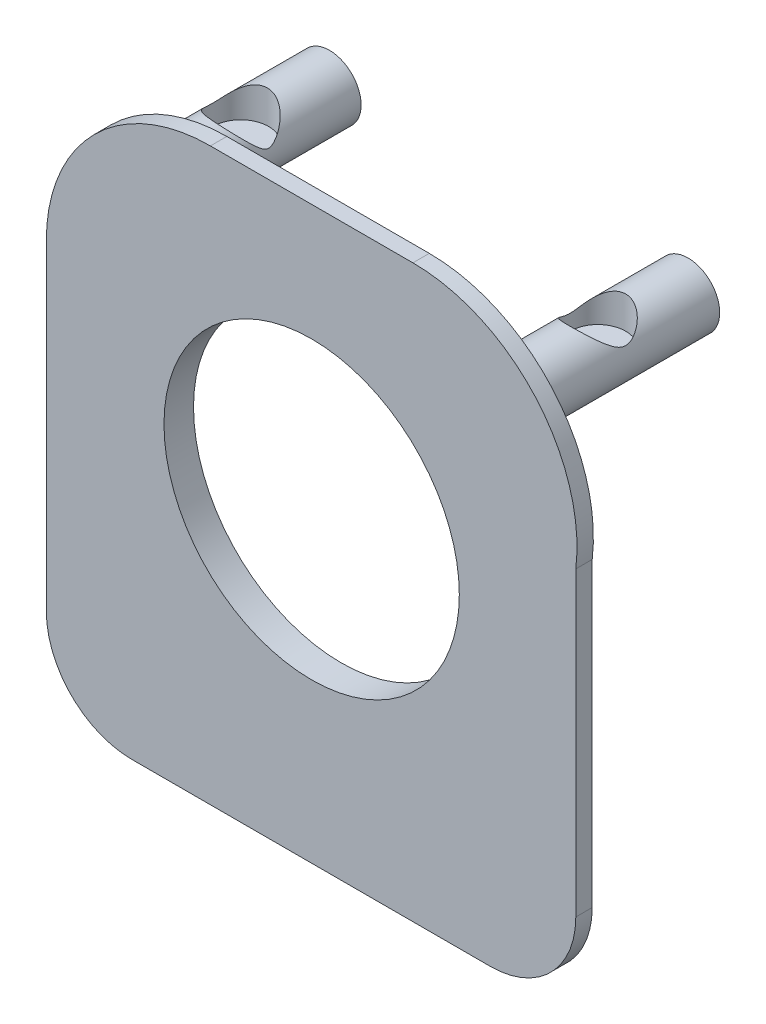
ISO-10303-21;
HEADER;
FILE_DESCRIPTION(('STEP AP214'),'2;1');
FILE_NAME('part.step','',(''),(''),'','','');
FILE_SCHEMA(('AUTOMOTIVE_DESIGN { 1 0 10303 214 1 1 1 1 }'));
ENDSEC;
DATA;
#1=APPLICATION_CONTEXT('core data for automotive mechanical design processes');
#2=APPLICATION_PROTOCOL_DEFINITION('international standard','automotive_design',2000,#1);
#3=PRODUCT_CONTEXT('',#1,'mechanical');
#4=PRODUCT('Part','Part','',(#3));
#5=PRODUCT_RELATED_PRODUCT_CATEGORY('part','',(#4));
#6=PRODUCT_DEFINITION_FORMATION('','',#4);
#7=PRODUCT_DEFINITION_CONTEXT('part definition',#1,'design');
#8=PRODUCT_DEFINITION('design','',#6,#7);
#9=PRODUCT_DEFINITION_SHAPE('','',#8);
#10=(LENGTH_UNIT() NAMED_UNIT(*) SI_UNIT(.MILLI.,.METRE.));
#11=(NAMED_UNIT(*) PLANE_ANGLE_UNIT() SI_UNIT($,.RADIAN.));
#12=(NAMED_UNIT(*) SI_UNIT($,.STERADIAN.) SOLID_ANGLE_UNIT());
#13=UNCERTAINTY_MEASURE_WITH_UNIT(LENGTH_MEASURE(1.E-05),#10,'distance_accuracy_value','');
#14=(GEOMETRIC_REPRESENTATION_CONTEXT(3) GLOBAL_UNCERTAINTY_ASSIGNED_CONTEXT((#13)) GLOBAL_UNIT_ASSIGNED_CONTEXT((#10,
#11,#12)) REPRESENTATION_CONTEXT('',''));
#15=CARTESIAN_POINT('',(0.,0.,0.));
#16=DIRECTION('',(0.,0.,1.));
#17=DIRECTION('',(1.,0.,0.));
#18=AXIS2_PLACEMENT_3D('',#15,#16,#17);
#19=CARTESIAN_POINT('',(0.,-15.3885977601007,-11.));
#20=DIRECTION('',(0.,0.,1.));
#21=DIRECTION('',(1.,0.,0.));
#22=AXIS2_PLACEMENT_3D('',#19,#20,#21);
#23=CYLINDRICAL_SURFACE('',#22,1.925);
#24=CARTESIAN_POINT('',(0.,-15.3885977601007,0.));
#25=DIRECTION('',(0.,0.,1.));
#26=DIRECTION('',(1.,0.,0.));
#27=AXIS2_PLACEMENT_3D('',#24,#25,#26);
#28=CIRCLE('',#27,1.925);
#29=CARTESIAN_POINT('',(1.925,-15.3885977601007,0.));
#30=VERTEX_POINT('',#29);
#31=EDGE_CURVE('E285',#30,#30,#28,.F.);
#32=ORIENTED_EDGE('',*,*,#31,.T.);
#33=EDGE_LOOP('',(#32));
#34=FACE_BOUND('',#33,.T.);
#35=CARTESIAN_POINT('',(0.,-15.3885977601007,-3.8));
#36=DIRECTION('',(0.,0.,-1.));
#37=DIRECTION('',(-1.,0.,0.));
#38=AXIS2_PLACEMENT_3D('',#35,#36,#37);
#39=CIRCLE('',#38,1.925);
#40=CARTESIAN_POINT('',(-1.925,-15.3885977601007,-3.8));
#41=VERTEX_POINT('',#40);
#42=EDGE_CURVE('E613',#41,#41,#39,.T.);
#43=ORIENTED_EDGE('',*,*,#42,.F.);
#44=EDGE_LOOP('',(#43));
#45=FACE_BOUND('',#44,.T.);
#46=ADVANCED_FACE('F121',(#34,#45),#23,.T.);
#47=CARTESIAN_POINT('',(10.8862060718335,-13.4632082932929,1.));
#48=DIRECTION('',(0.,0.,-1.));
#49=DIRECTION('',(-1.,0.,0.));
#50=AXIS2_PLACEMENT_3D('',#47,#48,#49);
#51=CYLINDRICAL_SURFACE('',#50,5.21379392816652);
#52=CARTESIAN_POINT('',(10.8862060718335,-13.4632082932929,0.));
#53=DIRECTION('',(0.,0.,1.));
#54=DIRECTION('',(1.,0.,0.));
#55=AXIS2_PLACEMENT_3D('',#52,#53,#54);
#56=CIRCLE('',#55,5.21379392816652);
#57=CARTESIAN_POINT('',(10.8862060718335,-18.6770022214594,0.));
#58=VERTEX_POINT('',#57);
#59=CARTESIAN_POINT('',(16.1,-13.4632082932929,0.));
#60=VERTEX_POINT('',#59);
#61=EDGE_CURVE('E235',#58,#60,#56,.T.);
#62=ORIENTED_EDGE('',*,*,#61,.T.);
#63=DIRECTION('',(0.,0.,-1.));
#64=VECTOR('',#63,1.);
#65=CARTESIAN_POINT('',(16.1,-13.4632082932929,1.));
#66=LINE('',#65,#64);
#67=CARTESIAN_POINT('',(16.1,-13.4632082932929,1.));
#68=VERTEX_POINT('',#67);
#69=EDGE_CURVE('E270',#68,#60,#66,.T.);
#70=ORIENTED_EDGE('',*,*,#69,.F.);
#71=CARTESIAN_POINT('',(10.8862060718335,-13.4632082932929,1.));
#72=DIRECTION('',(0.,0.,1.));
#73=DIRECTION('',(1.,0.,0.));
#74=AXIS2_PLACEMENT_3D('',#71,#72,#73);
#75=CIRCLE('',#74,5.21379392816652);
#76=CARTESIAN_POINT('',(10.8862060718335,-18.6770022214594,1.));
#77=VERTEX_POINT('',#76);
#78=EDGE_CURVE('E190',#77,#68,#75,.T.);
#79=ORIENTED_EDGE('',*,*,#78,.F.);
#80=DIRECTION('',(0.,0.,-1.));
#81=VECTOR('',#80,1.);
#82=CARTESIAN_POINT('',(10.8862060718335,-18.6770022214594,1.));
#83=LINE('',#82,#81);
#84=EDGE_CURVE('E274',#77,#58,#83,.T.);
#85=ORIENTED_EDGE('',*,*,#84,.T.);
#86=EDGE_LOOP('',(#62,#70,#79,#85));
#87=FACE_BOUND('',#86,.T.);
#88=ADVANCED_FACE('F318',(#87),#51,.T.);
#89=CARTESIAN_POINT('',(16.1,0.,1.));
#90=DIRECTION('',(-1.,0.,0.));
#91=DIRECTION('',(0.,0.,1.));
#92=AXIS2_PLACEMENT_3D('',#89,#90,#91);
#93=PLANE('',#92);
#94=DIRECTION('',(0.,1.,0.));
#95=VECTOR('',#94,1.);
#96=CARTESIAN_POINT('',(16.1,0.,0.));
#97=LINE('',#96,#95);
#98=CARTESIAN_POINT('',(16.1,4.90788373559151,0.));
#99=VERTEX_POINT('',#98);
#100=EDGE_CURVE('E239',#60,#99,#97,.T.);
#101=ORIENTED_EDGE('',*,*,#100,.T.);
#102=DIRECTION('',(0.,0.,-1.));
#103=VECTOR('',#102,1.);
#104=CARTESIAN_POINT('',(16.1,4.90788373559151,1.));
#105=LINE('',#104,#103);
#106=CARTESIAN_POINT('',(16.1,4.90788373559151,1.));
#107=VERTEX_POINT('',#106);
#108=EDGE_CURVE('E266',#107,#99,#105,.T.);
#109=ORIENTED_EDGE('',*,*,#108,.F.);
#110=DIRECTION('',(0.,1.,0.));
#111=VECTOR('',#110,1.);
#112=CARTESIAN_POINT('',(16.1,0.,1.));
#113=LINE('',#112,#111);
#114=EDGE_CURVE('E363',#68,#107,#113,.T.);
#115=ORIENTED_EDGE('',*,*,#114,.F.);
#116=ORIENTED_EDGE('',*,*,#69,.T.);
#117=EDGE_LOOP('',(#101,#109,#115,#116));
#118=FACE_BOUND('',#117,.T.);
#119=ADVANCED_FACE('F399',(#118),#93,.F.);
#120=CARTESIAN_POINT('',(6.17131132464449,6.1,1.));
#121=DIRECTION('',(0.,0.,-1.));
#122=DIRECTION('',(-1.,0.,0.));
#123=AXIS2_PLACEMENT_3D('',#120,#121,#122);
#124=CYLINDRICAL_SURFACE('',#123,10.);
#125=CARTESIAN_POINT('',(6.17131132464449,6.1,0.));
#126=DIRECTION('',(0.,0.,1.));
#127=DIRECTION('',(1.,0.,0.));
#128=AXIS2_PLACEMENT_3D('',#125,#126,#127);
#129=CIRCLE('',#128,10.);
#130=CARTESIAN_POINT('',(6.17131132464449,16.1,0.));
#131=VERTEX_POINT('',#130);
#132=EDGE_CURVE('E242',#99,#131,#129,.T.);
#133=ORIENTED_EDGE('',*,*,#132,.T.);
#134=DIRECTION('',(0.,0.,-1.));
#135=VECTOR('',#134,1.);
#136=CARTESIAN_POINT('',(6.17131132464449,16.1,1.));
#137=LINE('',#136,#135);
#138=CARTESIAN_POINT('',(6.17131132464449,16.1,1.));
#139=VERTEX_POINT('',#138);
#140=EDGE_CURVE('E263',#139,#131,#137,.T.);
#141=ORIENTED_EDGE('',*,*,#140,.F.);
#142=CARTESIAN_POINT('',(6.17131132464449,6.1,1.));
#143=DIRECTION('',(0.,0.,1.));
#144=DIRECTION('',(1.,0.,0.));
#145=AXIS2_PLACEMENT_3D('',#142,#143,#144);
#146=CIRCLE('',#145,10.);
#147=EDGE_CURVE('E366',#107,#139,#146,.T.);
#148=ORIENTED_EDGE('',*,*,#147,.F.);
#149=ORIENTED_EDGE('',*,*,#108,.T.);
#150=EDGE_LOOP('',(#133,#141,#148,#149));
#151=FACE_BOUND('',#150,.T.);
#152=ADVANCED_FACE('F396',(#151),#124,.T.);
#153=CARTESIAN_POINT('',(0.,16.1,1.));
#154=DIRECTION('',(0.,1.,0.));
#155=DIRECTION('',(0.,0.,1.));
#156=AXIS2_PLACEMENT_3D('',#153,#154,#155);
#157=PLANE('',#156);
#158=DIRECTION('',(1.,0.,0.));
#159=VECTOR('',#158,1.);
#160=CARTESIAN_POINT('',(0.,16.1,0.));
#161=LINE('',#160,#159);
#162=CARTESIAN_POINT('',(-6.17131132464449,16.1,0.));
#163=VERTEX_POINT('',#162);
#164=EDGE_CURVE('E246',#163,#131,#161,.T.);
#165=ORIENTED_EDGE('',*,*,#164,.F.);
#166=DIRECTION('',(0.,0.,-1.));
#167=VECTOR('',#166,1.);
#168=CARTESIAN_POINT('',(-6.17131132464449,16.1,1.));
#169=LINE('',#168,#167);
#170=CARTESIAN_POINT('',(-6.17131132464449,16.1,1.));
#171=VERTEX_POINT('',#170);
#172=EDGE_CURVE('E220',#171,#163,#169,.T.);
#173=ORIENTED_EDGE('',*,*,#172,.F.);
#174=DIRECTION('',(1.,0.,0.));
#175=VECTOR('',#174,1.);
#176=CARTESIAN_POINT('',(0.,16.1,1.));
#177=LINE('',#176,#175);
#178=EDGE_CURVE('E211',#171,#139,#177,.T.);
#179=ORIENTED_EDGE('',*,*,#178,.T.);
#180=ORIENTED_EDGE('',*,*,#140,.T.);
#181=EDGE_LOOP('',(#165,#173,#179,#180));
#182=FACE_BOUND('',#181,.T.);
#183=ADVANCED_FACE('F371',(#182),#157,.T.);
#184=CARTESIAN_POINT('',(-6.17131132464449,6.1,1.));
#185=DIRECTION('',(0.,0.,-1.));
#186=DIRECTION('',(-1.,0.,0.));
#187=AXIS2_PLACEMENT_3D('',#184,#185,#186);
#188=CYLINDRICAL_SURFACE('',#187,10.);
#189=CARTESIAN_POINT('',(-6.17131132464449,6.1,0.));
#190=DIRECTION('',(0.,0.,1.));
#191=DIRECTION('',(1.,0.,0.));
#192=AXIS2_PLACEMENT_3D('',#189,#190,#191);
#193=CIRCLE('',#192,10.);
#194=CARTESIAN_POINT('',(-16.1713113246445,6.09999999999993,0.));
#195=VERTEX_POINT('',#194);
#196=EDGE_CURVE('E218',#163,#195,#193,.T.);
#197=ORIENTED_EDGE('',*,*,#196,.T.);
#198=DIRECTION('',(0.,0.,-1.));
#199=VECTOR('',#198,1.);
#200=CARTESIAN_POINT('',(-16.1713113246445,6.09999999999993,1.));
#201=LINE('',#200,#199);
#202=CARTESIAN_POINT('',(-16.1713113246445,6.09999999999993,1.));
#203=VERTEX_POINT('',#202);
#204=EDGE_CURVE('E215',#203,#195,#201,.T.);
#205=ORIENTED_EDGE('',*,*,#204,.F.);
#206=CARTESIAN_POINT('',(-6.17131132464449,6.1,1.));
#207=DIRECTION('',(0.,0.,1.));
#208=DIRECTION('',(1.,0.,0.));
#209=AXIS2_PLACEMENT_3D('',#206,#207,#208);
#210=CIRCLE('',#209,10.);
#211=EDGE_CURVE('E204',#171,#203,#210,.T.);
#212=ORIENTED_EDGE('',*,*,#211,.F.);
#213=ORIENTED_EDGE('',*,*,#172,.T.);
#214=EDGE_LOOP('',(#197,#205,#212,#213));
#215=FACE_BOUND('',#214,.T.);
#216=ADVANCED_FACE('F216',(#215),#188,.T.);
#217=CARTESIAN_POINT('',(-16.1713113246445,0.,1.));
#218=DIRECTION('',(1.,0.,0.));
#219=DIRECTION('',(0.,0.,-1.));
#220=AXIS2_PLACEMENT_3D('',#217,#218,#219);
#221=PLANE('',#220);
#222=DIRECTION('',(0.,-1.,0.));
#223=VECTOR('',#222,1.);
#224=CARTESIAN_POINT('',(-16.1713113246445,0.,0.));
#225=LINE('',#224,#223);
#226=CARTESIAN_POINT('',(-16.1713113246445,-13.4632082932929,0.));
#227=VERTEX_POINT('',#226);
#228=EDGE_CURVE('E175',#195,#227,#225,.T.);
#229=ORIENTED_EDGE('',*,*,#228,.T.);
#230=DIRECTION('',(0.,0.,-1.));
#231=VECTOR('',#230,1.);
#232=CARTESIAN_POINT('',(-16.1713113246445,-13.4632082932929,1.));
#233=LINE('',#232,#231);
#234=CARTESIAN_POINT('',(-16.1713113246445,-13.4632082932929,1.));
#235=VERTEX_POINT('',#234);
#236=EDGE_CURVE('E221',#235,#227,#233,.T.);
#237=ORIENTED_EDGE('',*,*,#236,.F.);
#238=DIRECTION('',(0.,-1.,0.));
#239=VECTOR('',#238,1.);
#240=CARTESIAN_POINT('',(-16.1713113246445,0.,1.));
#241=LINE('',#240,#239);
#242=EDGE_CURVE('E209',#203,#235,#241,.T.);
#243=ORIENTED_EDGE('',*,*,#242,.F.);
#244=ORIENTED_EDGE('',*,*,#204,.T.);
#245=EDGE_LOOP('',(#229,#237,#243,#244));
#246=FACE_BOUND('',#245,.T.);
#247=ADVANCED_FACE('F223',(#246),#221,.F.);
#248=CARTESIAN_POINT('',(-10.957517396478,-13.4632082932929,1.));
#249=DIRECTION('',(0.,0.,-1.));
#250=DIRECTION('',(-1.,0.,0.));
#251=AXIS2_PLACEMENT_3D('',#248,#249,#250);
#252=CYLINDRICAL_SURFACE('',#251,5.21379392816652);
#253=CARTESIAN_POINT('',(-10.957517396478,-13.4632082932929,0.));
#254=DIRECTION('',(0.,0.,1.));
#255=DIRECTION('',(1.,0.,0.));
#256=AXIS2_PLACEMENT_3D('',#253,#254,#255);
#257=CIRCLE('',#256,5.21379392816652);
#258=CARTESIAN_POINT('',(-10.957517396478,-18.6770022214594,0.));
#259=VERTEX_POINT('',#258);
#260=EDGE_CURVE('E181',#227,#259,#257,.T.);
#261=ORIENTED_EDGE('',*,*,#260,.T.);
#262=DIRECTION('',(0.,0.,-1.));
#263=VECTOR('',#262,1.);
#264=CARTESIAN_POINT('',(-10.957517396478,-18.6770022214594,1.));
#265=LINE('',#264,#263);
#266=CARTESIAN_POINT('',(-10.957517396478,-18.6770022214594,1.));
#267=VERTEX_POINT('',#266);
#268=EDGE_CURVE('E227',#267,#259,#265,.T.);
#269=ORIENTED_EDGE('',*,*,#268,.F.);
#270=CARTESIAN_POINT('',(-10.957517396478,-13.4632082932929,1.));
#271=DIRECTION('',(0.,0.,1.));
#272=DIRECTION('',(1.,0.,0.));
#273=AXIS2_PLACEMENT_3D('',#270,#271,#272);
#274=CIRCLE('',#273,5.21379392816652);
#275=EDGE_CURVE('E146',#235,#267,#274,.T.);
#276=ORIENTED_EDGE('',*,*,#275,.F.);
#277=ORIENTED_EDGE('',*,*,#236,.T.);
#278=EDGE_LOOP('',(#261,#269,#276,#277));
#279=FACE_BOUND('',#278,.T.);
#280=ADVANCED_FACE('F381',(#279),#252,.T.);
#281=CARTESIAN_POINT('',(0.,-18.6770022214594,1.));
#282=DIRECTION('',(0.,1.,0.));
#283=DIRECTION('',(0.,0.,1.));
#284=AXIS2_PLACEMENT_3D('',#281,#282,#283);
#285=PLANE('',#284);
#286=DIRECTION('',(1.,0.,0.));
#287=VECTOR('',#286,1.);
#288=CARTESIAN_POINT('',(0.,-18.6770022214594,0.));
#289=LINE('',#288,#287);
#290=EDGE_CURVE('E231',#259,#58,#289,.T.);
#291=ORIENTED_EDGE('',*,*,#290,.T.);
#292=ORIENTED_EDGE('',*,*,#84,.F.);
#293=DIRECTION('',(1.,0.,0.));
#294=VECTOR('',#293,1.);
#295=CARTESIAN_POINT('',(0.,-18.6770022214594,1.));
#296=LINE('',#295,#294);
#297=EDGE_CURVE('E256',#267,#77,#296,.T.);
#298=ORIENTED_EDGE('',*,*,#297,.F.);
#299=ORIENTED_EDGE('',*,*,#268,.T.);
#300=EDGE_LOOP('',(#291,#292,#298,#299));
#301=FACE_BOUND('',#300,.T.);
#302=ADVANCED_FACE('F123',(#301),#285,.F.);
#303=CARTESIAN_POINT('',(0.,0.,0.));
#304=DIRECTION('',(0.,0.,1.));
#305=DIRECTION('',(1.,0.,0.));
#306=AXIS2_PLACEMENT_3D('',#303,#304,#305);
#307=PLANE('',#306);
#308=ORIENTED_EDGE('',*,*,#31,.F.);
#309=EDGE_LOOP('',(#308));
#310=FACE_BOUND('',#309,.T.);
#311=CARTESIAN_POINT('',(-10.9107197436623,10.8519646008193,0.));
#312=DIRECTION('',(0.,0.,1.));
#313=DIRECTION('',(1.,0.,0.));
#314=AXIS2_PLACEMENT_3D('',#311,#312,#313);
#315=CIRCLE('',#314,1.925);
#316=CARTESIAN_POINT('',(-8.98571974366226,10.8519646008193,0.));
#317=VERTEX_POINT('',#316);
#318=EDGE_CURVE('E281',#317,#317,#315,.F.);
#319=ORIENTED_EDGE('',*,*,#318,.F.);
#320=EDGE_LOOP('',(#319));
#321=FACE_BOUND('',#320,.T.);
#322=CARTESIAN_POINT('',(10.9444590620381,10.8179926058548,0.));
#323=DIRECTION('',(0.,0.,1.));
#324=DIRECTION('',(1.,0.,0.));
#325=AXIS2_PLACEMENT_3D('',#322,#323,#324);
#326=CIRCLE('',#325,1.925);
#327=CARTESIAN_POINT('',(12.8694590620381,10.8179926058548,0.));
#328=VERTEX_POINT('',#327);
#329=EDGE_CURVE('E277',#328,#328,#326,.F.);
#330=ORIENTED_EDGE('',*,*,#329,.F.);
#331=EDGE_LOOP('',(#330));
#332=FACE_BOUND('',#331,.T.);
#333=CARTESIAN_POINT('',(0.,0.,0.));
#334=DIRECTION('',(0.,0.,1.));
#335=DIRECTION('',(1.,0.,0.));
#336=AXIS2_PLACEMENT_3D('',#333,#334,#335);
#337=CIRCLE('',#336,12.1);
#338=CARTESIAN_POINT('',(12.1,0.,0.));
#339=VERTEX_POINT('',#338);
#340=EDGE_CURVE('E236',#339,#339,#337,.T.);
#341=ORIENTED_EDGE('',*,*,#340,.T.);
#342=EDGE_LOOP('',(#341));
#343=FACE_BOUND('',#342,.T.);
#344=ORIENTED_EDGE('',*,*,#290,.F.);
#345=ORIENTED_EDGE('',*,*,#260,.F.);
#346=ORIENTED_EDGE('',*,*,#228,.F.);
#347=ORIENTED_EDGE('',*,*,#196,.F.);
#348=ORIENTED_EDGE('',*,*,#164,.T.);
#349=ORIENTED_EDGE('',*,*,#132,.F.);
#350=ORIENTED_EDGE('',*,*,#100,.F.);
#351=ORIENTED_EDGE('',*,*,#61,.F.);
#352=EDGE_LOOP('',(#344,#345,#346,#347,#348,#349,#350,#351));
#353=FACE_BOUND('',#352,.T.);
#354=ADVANCED_FACE('F375',(#310,#321,#332,#343,#353),#307,.F.);
#355=CARTESIAN_POINT('',(0.,0.,1.));
#356=DIRECTION('',(0.,0.,1.));
#357=DIRECTION('',(1.,0.,0.));
#358=AXIS2_PLACEMENT_3D('',#355,#356,#357);
#359=PLANE('',#358);
#360=ORIENTED_EDGE('',*,*,#297,.T.);
#361=ORIENTED_EDGE('',*,*,#78,.T.);
#362=ORIENTED_EDGE('',*,*,#114,.T.);
#363=ORIENTED_EDGE('',*,*,#147,.T.);
#364=ORIENTED_EDGE('',*,*,#178,.F.);
#365=ORIENTED_EDGE('',*,*,#211,.T.);
#366=ORIENTED_EDGE('',*,*,#242,.T.);
#367=ORIENTED_EDGE('',*,*,#275,.T.);
#368=EDGE_LOOP('',(#360,#361,#362,#363,#364,#365,#366,#367));
#369=FACE_BOUND('',#368,.T.);
#370=CARTESIAN_POINT('',(0.,0.,1.));
#371=DIRECTION('',(0.,0.,1.));
#372=DIRECTION('',(1.,0.,0.));
#373=AXIS2_PLACEMENT_3D('',#370,#371,#372);
#374=CIRCLE('',#373,9.);
#375=CARTESIAN_POINT('',(9.,0.,1.));
#376=VERTEX_POINT('',#375);
#377=EDGE_CURVE('E337',#376,#376,#374,.T.);
#378=ORIENTED_EDGE('',*,*,#377,.F.);
#379=EDGE_LOOP('',(#378));
#380=FACE_BOUND('',#379,.T.);
#381=ADVANCED_FACE('F206',(#369,#380),#359,.T.);
#382=CARTESIAN_POINT('',(0.,0.,-0.8));
#383=DIRECTION('',(0.,0.,1.));
#384=DIRECTION('',(1.,0.,0.));
#385=AXIS2_PLACEMENT_3D('',#382,#383,#384);
#386=CYLINDRICAL_SURFACE('',#385,12.1);
#387=CARTESIAN_POINT('',(0.,0.,-0.8));
#388=DIRECTION('',(0.,0.,1.));
#389=DIRECTION('',(1.,0.,0.));
#390=AXIS2_PLACEMENT_3D('',#387,#388,#389);
#391=CIRCLE('',#390,12.1);
#392=CARTESIAN_POINT('',(12.1,0.,-0.8));
#393=VERTEX_POINT('',#392);
#394=EDGE_CURVE('E349',#393,#393,#391,.T.);
#395=ORIENTED_EDGE('',*,*,#394,.T.);
#396=EDGE_LOOP('',(#395));
#397=FACE_BOUND('',#396,.T.);
#398=ORIENTED_EDGE('',*,*,#340,.F.);
#399=EDGE_LOOP('',(#398));
#400=FACE_BOUND('',#399,.T.);
#401=ADVANCED_FACE('F452',(#397,#400),#386,.T.);
#402=CARTESIAN_POINT('',(0.,0.,-0.8));
#403=DIRECTION('',(0.,0.,1.));
#404=DIRECTION('',(1.,0.,0.));
#405=AXIS2_PLACEMENT_3D('',#402,#403,#404);
#406=PLANE('',#405);
#407=CARTESIAN_POINT('',(0.,0.,-0.8));
#408=DIRECTION('',(0.,0.,1.));
#409=DIRECTION('',(1.,0.,0.));
#410=AXIS2_PLACEMENT_3D('',#407,#408,#409);
#411=CIRCLE('',#410,9.);
#412=CARTESIAN_POINT('',(9.,0.,-0.8));
#413=VERTEX_POINT('',#412);
#414=EDGE_CURVE('E345',#413,#413,#411,.T.);
#415=ORIENTED_EDGE('',*,*,#414,.T.);
#416=EDGE_LOOP('',(#415));
#417=FACE_BOUND('',#416,.T.);
#418=ORIENTED_EDGE('',*,*,#394,.F.);
#419=EDGE_LOOP('',(#418));
#420=FACE_BOUND('',#419,.T.);
#421=ADVANCED_FACE('F461',(#417,#420),#406,.F.);
#422=CARTESIAN_POINT('',(0.,0.,-0.8));
#423=DIRECTION('',(0.,0.,1.));
#424=DIRECTION('',(1.,0.,0.));
#425=AXIS2_PLACEMENT_3D('',#422,#423,#424);
#426=CYLINDRICAL_SURFACE('',#425,9.);
#427=ORIENTED_EDGE('',*,*,#414,.F.);
#428=EDGE_LOOP('',(#427));
#429=FACE_BOUND('',#428,.T.);
#430=ORIENTED_EDGE('',*,*,#377,.T.);
#431=EDGE_LOOP('',(#430));
#432=FACE_BOUND('',#431,.T.);
#433=ADVANCED_FACE('F471',(#429,#432),#426,.F.);
#434=CARTESIAN_POINT('',(10.9444590620381,10.8179926058548,-11.));
#435=DIRECTION('',(0.,0.,1.));
#436=DIRECTION('',(1.,0.,0.));
#437=AXIS2_PLACEMENT_3D('',#434,#435,#436);
#438=CYLINDRICAL_SURFACE('',#437,1.925);
#439=CARTESIAN_POINT('',(10.9444590620381,12.7429926058548,-3.8));
#440=CARTESIAN_POINT('',(10.8651312449388,12.7429922571381,-3.80000034987404));
#441=CARTESIAN_POINT('',(10.7858008266382,12.7380491542038,-3.80559166988942));
#442=CARTESIAN_POINT('',(10.6298244056471,12.7187335985418,-3.82751156179412));
#443=CARTESIAN_POINT('',(10.5531797568067,12.7043564603066,-3.84384546910568));
#444=CARTESIAN_POINT('',(10.4051931948833,12.6674801682433,-3.88597321923052));
#445=CARTESIAN_POINT('',(10.3338219610919,12.6450307633222,-3.91170913323439));
#446=CARTESIAN_POINT('',(10.1971433097917,12.5935179881708,-3.97124674502862));
#447=CARTESIAN_POINT('',(10.131838449694,12.5644518461694,-4.00505182330509));
#448=CARTESIAN_POINT('',(9.98368784332116,12.4888881830676,-4.0939347788121));
#449=CARTESIAN_POINT('',(9.90394554553209,12.4400151948895,-4.15216553411364));
#450=CARTESIAN_POINT('',(9.75761333636642,12.3362520076701,-4.27900769099729));
#451=CARTESIAN_POINT('',(9.69105804862391,12.2813465416855,-4.34764560569219));
#452=CARTESIAN_POINT('',(9.56959002795531,12.1679459856964,-4.49545808442536));
#453=CARTESIAN_POINT('',(9.51497044273612,12.1093981181577,-4.57483369833959));
#454=CARTESIAN_POINT('',(9.44324664103553,12.0235575234559,-4.70082414507871));
#455=CARTESIAN_POINT('',(9.42104882152633,11.9952888410778,-4.74395045257629));
#456=CARTESIAN_POINT('',(9.38011453630348,11.9403203668329,-4.83275389786023));
#457=CARTESIAN_POINT('',(9.36137555718784,11.9136194454341,-4.87842915174536));
#458=CARTESIAN_POINT('',(9.32723549999801,11.8625842012857,-4.97351353879714));
#459=CARTESIAN_POINT('',(9.31190204278856,11.838302346756,-5.0229758396964));
#460=CARTESIAN_POINT('',(9.28546847802962,11.7947342849691,-5.12513543316055));
#461=CARTESIAN_POINT('',(9.27436128263741,11.7754397311221,-5.17782713580742));
#462=CARTESIAN_POINT('',(9.25844514035575,11.7470820941956,-5.27756824780974));
#463=CARTESIAN_POINT('',(9.25291059014657,11.7368726242968,-5.32416234285913));
#464=CARTESIAN_POINT('',(9.24575088066518,11.7235740982044,-5.41862206376112));
#465=CARTESIAN_POINT('',(9.24411821869219,11.7204713773591,-5.46648507014027));
#466=CARTESIAN_POINT('',(9.24492023779686,11.7219795113984,-5.56212007132397));
#467=CARTESIAN_POINT('',(9.24736104592461,11.7266019860367,-5.60989182062967));
#468=CARTESIAN_POINT('',(9.25607161108988,11.742683019749,-5.70393646601569));
#469=CARTESIAN_POINT('',(9.26234936199731,11.7541558496689,-5.75020601991876));
#470=CARTESIAN_POINT('',(9.28268702977327,11.7899761655384,-5.86550988817081));
#471=CARTESIAN_POINT('',(9.29913124611843,11.817934959902,-5.93296458081195));
#472=CARTESIAN_POINT('',(9.33882552092759,11.8805124482225,-6.06265104955517));
#473=CARTESIAN_POINT('',(9.36210422415144,11.9151589580813,-6.12485939511877));
#474=CARTESIAN_POINT('',(9.41070998185543,11.9818973277625,-6.23528957599662));
#475=CARTESIAN_POINT('',(9.43515032852367,12.0135439752069,-6.28417902322329));
#476=CARTESIAN_POINT('',(9.48830406516451,12.0777466926112,-6.37895803402001));
#477=CARTESIAN_POINT('',(9.51702011693882,12.110303318741,-6.42484570306266));
#478=CARTESIAN_POINT('',(9.60950377235915,12.2077797012907,-6.5581080820089));
#479=CARTESIAN_POINT('',(9.67968832152576,12.2726252698864,-6.64126541781195));
#480=CARTESIAN_POINT('',(9.82095191193137,12.3831355985121,-6.778789141341));
#481=CARTESIAN_POINT('',(9.88879891010384,12.4299820161467,-6.83554448373818));
#482=CARTESIAN_POINT('',(10.0353861467697,12.5169432602298,-6.93931120234539));
#483=CARTESIAN_POINT('',(10.1141059706801,12.5570703973748,-6.98634043621106));
#484=CARTESIAN_POINT('',(10.264827183208,12.6204929203277,-7.06001735849539));
#485=CARTESIAN_POINT('',(10.3350069975931,12.645550071351,-7.08886120748845));
#486=CARTESIAN_POINT('',(10.4807446102223,12.6878414806688,-7.13733061013507));
#487=CARTESIAN_POINT('',(10.5562992167413,12.7050803375916,-7.15696158293068));
#488=CARTESIAN_POINT('',(10.7113814703506,12.7304527670266,-7.18580137512802));
#489=CARTESIAN_POINT('',(10.7909301207026,12.7385314361731,-7.19494735425481));
#490=CARTESIAN_POINT('',(10.9509010979794,12.7446430674138,-7.20186960388454));
#491=CARTESIAN_POINT('',(11.0313231276052,12.7426793472104,-7.19964962935532));
#492=CARTESIAN_POINT('',(11.1824690923083,12.7295818542664,-7.18480215038744));
#493=CARTESIAN_POINT('',(11.2533787052353,12.7193533680473,-7.17320201698471));
#494=CARTESIAN_POINT('',(11.3918063325508,12.6916232816393,-7.14162231571262));
#495=CARTESIAN_POINT('',(11.4593235782228,12.6741200412355,-7.12164085812421));
#496=CARTESIAN_POINT('',(11.5932045197576,12.6318141892996,-7.07304633274847));
#497=CARTESIAN_POINT('',(11.6593096382398,12.6066688322979,-7.04402588007));
#498=CARTESIAN_POINT('',(11.7854962862025,12.550922995281,-6.97908727662714));
#499=CARTESIAN_POINT('',(11.8455762313634,12.5203210863109,-6.94316731883837));
#500=CARTESIAN_POINT('',(11.9886187007225,12.4382427693043,-6.84558713866848));
#501=CARTESIAN_POINT('',(12.0675056983055,12.3841120616308,-6.78017607194717));
#502=CARTESIAN_POINT('',(12.2109561392276,12.2705783243812,-6.63851806142504));
#503=CARTESIAN_POINT('',(12.2754572267146,12.2111538472493,-6.56222620834505));
#504=CARTESIAN_POINT('',(12.362077246039,12.1209819020852,-6.43964296582871));
#505=CARTESIAN_POINT('',(12.389514105475,12.0903973613336,-6.39688847764791));
#506=CARTESIAN_POINT('',(12.4406529147279,12.0298492957507,-6.30870670783307));
#507=CARTESIAN_POINT('',(12.4643523453345,11.99988620152,-6.26327765149633));
#508=CARTESIAN_POINT('',(12.5078036568731,11.9417755316756,-6.16977650996442));
#509=CARTESIAN_POINT('',(12.5275727459533,11.913620424414,-6.12171717632387));
#510=CARTESIAN_POINT('',(12.563035569268,11.8605135035688,-6.02247683152717));
#511=CARTESIAN_POINT('',(12.5787359956817,11.8355564643991,-5.97130111970431));
#512=CARTESIAN_POINT('',(12.6039497462152,11.7938189367987,-5.87199091293981));
#513=CARTESIAN_POINT('',(12.6139882003592,11.776408869116,-5.8242634135382));
#514=CARTESIAN_POINT('',(12.630044410848,11.7478842500479,-5.72637879753337));
#515=CARTESIAN_POINT('',(12.6360745679939,11.7367502981215,-5.67622969420414));
#516=CARTESIAN_POINT('',(12.6436398780406,11.7226933115765,-5.57377107182627));
#517=CARTESIAN_POINT('',(12.6451213436884,11.7198683626116,-5.52144308347203));
#518=CARTESIAN_POINT('',(12.6432424923284,11.7233990201611,-5.41716585185429));
#519=CARTESIAN_POINT('',(12.639877672837,11.729763163896,-5.36521700591951));
#520=CARTESIAN_POINT('',(12.6277216388157,11.7520320396497,-5.25452326195068));
#521=CARTESIAN_POINT('',(12.6180812586312,11.7694159376612,-5.19618696289501));
#522=CARTESIAN_POINT('',(12.593593183744,11.8112518705823,-5.08319481948675));
#523=CARTESIAN_POINT('',(12.5787256851835,11.8357307231518,-5.02855392801572));
#524=CARTESIAN_POINT('',(12.5462895208251,11.885964472381,-4.92851199363267));
#525=CARTESIAN_POINT('',(12.5291773759573,11.9113055864637,-4.8827467457523));
#526=CARTESIAN_POINT('',(12.4915718870271,11.9639057724048,-4.79376025451848));
#527=CARTESIAN_POINT('',(12.4710759846424,11.9911662864307,-4.75054096986992));
#528=CARTESIAN_POINT('',(12.4046522149816,12.0743666721495,-4.62426507826642));
#529=CARTESIAN_POINT('',(12.3538094849598,12.1316901916106,-4.54465389269348));
#530=CARTESIAN_POINT('',(12.2348932729269,12.249054591207,-4.38865540521821));
#531=CARTESIAN_POINT('',(12.1658223835641,12.3089822084164,-4.31294377663915));
#532=CARTESIAN_POINT('',(12.0123650954659,12.4224425533026,-4.17324515557218));
#533=CARTESIAN_POINT('',(11.9280191703537,12.4759915749023,-4.10922805612838));
#534=CARTESIAN_POINT('',(11.7709020860039,12.5581224402501,-4.01242821860553));
#535=CARTESIAN_POINT('',(11.7018339287973,12.5894467743561,-3.97596605843435));
#536=CARTESIAN_POINT('',(11.5568132515842,12.6446410413273,-3.91214667731987));
#537=CARTESIAN_POINT('',(11.4808672276984,12.6685179154715,-3.88478097660278));
#538=CARTESIAN_POINT('',(11.3291545742462,12.7056621200443,-3.84236075947782));
#539=CARTESIAN_POINT('',(11.2537485978208,12.7195558685186,-3.82657768076967));
#540=CARTESIAN_POINT('',(11.1003814901442,12.7382192167979,-3.80539948125624));
#541=CARTESIAN_POINT('',(11.0224215323066,12.7429929485696,-3.7999996561478));
#542=CARTESIAN_POINT('',(10.9444590620381,12.7429926058548,-3.8));
#543=B_SPLINE_CURVE_WITH_KNOTS('',3,(#439,#440,#441,#442,#443,#444,#445,#446,#447,#448,#449,
#450,#451,#452,#453,#454,#455,#456,#457,#458,#459,#460,#461,#462,#463,#464,#465,#466,#467,#468,
#469,#470,#471,#472,#473,#474,#475,#476,#477,#478,#479,#480,#481,#482,#483,#484,#485,#486,#487,
#488,#489,#490,#491,#492,#493,#494,#495,#496,#497,#498,#499,#500,#501,#502,#503,#504,#505,#506,
#507,#508,#509,#510,#511,#512,#513,#514,#515,#516,#517,#518,#519,#520,#521,#522,#523,#524,#525,
#526,#527,#528,#529,#530,#531,#532,#533,#534,#535,#536,#537,#538,#539,#540,#541,#542),
.UNSPECIFIED.,.T.,.F.,(4,2,2,2,2,2,2,2,2,2,2,2,2,2,2,2,2,2,2,2,2,2,2,2,2,2,2,2,2,2,2,2,2,2,2,2,
2,2,2,2,2,2,2,2,2,2,2,2,2,2,2,4),(0.,0.237653869269037,0.475425861129117,0.711756911378802,
0.948187144187556,1.27690670207058,1.60647822599653,1.94340870022543,2.11169331346707,
2.27985515535778,2.45110529599828,2.62206695453505,2.76553548777185,2.90872793145346,
3.0521359501164,3.19584376771198,3.41911745064778,3.64334061461481,3.83256920706462,
4.02191609845827,4.39991757815491,4.69917519458245,4.99787838201066,5.23664275295519,
5.4752665027955,5.71531305293911,5.95528030407041,6.17203820128739,6.3888449967313,
6.61734408629279,6.8459031030253,7.19173123567505,7.53903042600823,7.7167798274024,
7.89464853317721,8.07172044511679,8.24849923172894,8.40340829223965,8.55783583901779,
8.71407918886911,8.87046779163744,9.05431993177998,9.23887627064222,9.40377057487341,
9.56879012479676,9.89905365619603,10.2537820998442,10.6075840318631,10.8591043480824,
11.1103895336721,11.3440589277486,11.5776224291105),.UNSPECIFIED.);
#544=CARTESIAN_POINT('',(10.9444590620381,12.7429926058548,-3.8));
#545=VERTEX_POINT('',#544);
#546=EDGE_CURVE('E125',#545,#545,#543,.T.);
#547=ORIENTED_EDGE('',*,*,#546,.T.);
#548=EDGE_LOOP('',(#547));
#549=FACE_BOUND('',#548,.T.);
#550=CARTESIAN_POINT('',(10.9444590620381,10.8179926058548,-11.));
#551=DIRECTION('',(0.,0.,-1.));
#552=DIRECTION('',(-1.,0.,0.));
#553=AXIS2_PLACEMENT_3D('',#550,#551,#552);
#554=CIRCLE('',#553,1.925);
#555=CARTESIAN_POINT('',(9.01945906203807,10.8179926058548,-11.));
#556=VERTEX_POINT('',#555);
#557=EDGE_CURVE('E332',#556,#556,#554,.T.);
#558=ORIENTED_EDGE('',*,*,#557,.F.);
#559=EDGE_LOOP('',(#558));
#560=FACE_BOUND('',#559,.T.);
#561=ORIENTED_EDGE('',*,*,#329,.T.);
#562=EDGE_LOOP('',(#561));
#563=FACE_BOUND('',#562,.T.);
#564=ADVANCED_FACE('F481',(#549,#560,#563),#438,.T.);
#565=CARTESIAN_POINT('',(10.9444590620381,10.8179926058548,-11.));
#566=DIRECTION('',(0.,0.,-1.));
#567=DIRECTION('',(-1.,0.,0.));
#568=AXIS2_PLACEMENT_3D('',#565,#566,#567);
#569=PLANE('',#568);
#570=ORIENTED_EDGE('',*,*,#557,.T.);
#571=EDGE_LOOP('',(#570));
#572=FACE_BOUND('',#571,.T.);
#573=ADVANCED_FACE('F325',(#572),#569,.T.);
#574=CARTESIAN_POINT('',(-10.9107197436623,10.8519646008193,-11.));
#575=DIRECTION('',(0.,0.,1.));
#576=DIRECTION('',(1.,0.,0.));
#577=AXIS2_PLACEMENT_3D('',#574,#575,#576);
#578=CYLINDRICAL_SURFACE('',#577,1.925);
#579=CARTESIAN_POINT('',(-10.7453463466527,12.7698479756786,-3.72519913676642));
#580=CARTESIAN_POINT('',(-10.8226094410173,12.7765120165722,-3.72519750049788));
#581=CARTESIAN_POINT('',(-10.9002730304818,12.7784679490235,-3.73050089413866));
#582=CARTESIAN_POINT('',(-11.0538282175239,12.7731749710834,-3.75162593664825));
#583=CARTESIAN_POINT('',(-11.1297195025836,12.765924449575,-3.76744942628873));
#584=CARTESIAN_POINT('',(-11.2771067133488,12.7432409379764,-3.80870092869235));
#585=CARTESIAN_POINT('',(-11.3486218975775,12.7278471868525,-3.83408271627899));
#586=CARTESIAN_POINT('',(-11.4861578136918,12.6903304721461,-3.89326735078034));
#587=CARTESIAN_POINT('',(-11.5521753964828,12.66820368511,-3.92707498045435));
#588=CARTESIAN_POINT('',(-11.6984964932564,12.6106776858167,-4.01419112034018));
#589=CARTESIAN_POINT('',(-11.7763791602857,12.573305786458,-4.07025837165351));
#590=CARTESIAN_POINT('',(-11.9202397406912,12.4930930796807,-4.19288465832515));
#591=CARTESIAN_POINT('',(-11.9861924928434,12.4502410315146,-4.2594653263555));
#592=CARTESIAN_POINT('',(-12.1069480538666,12.362043943875,-4.40295030912861));
#593=CARTESIAN_POINT('',(-12.1615407913758,12.3166687952644,-4.48001176265039));
#594=CARTESIAN_POINT('',(-12.2577933634748,12.2286409476233,-4.64323301490011));
#595=CARTESIAN_POINT('',(-12.2994709255158,12.1859845812736,-4.72938012280223));
#596=CARTESIAN_POINT('',(-12.3568008333613,12.1230394032113,-4.87995816125217));
#597=CARTESIAN_POINT('',(-12.3764782961188,12.1000921506616,-4.94172897849434));
#598=CARTESIAN_POINT('',(-12.4089199998288,12.0609589802556,-5.06907710323459));
#599=CARTESIAN_POINT('',(-12.4216999340729,12.0447577332253,-5.13464539079042));
#600=CARTESIAN_POINT('',(-12.4395736832167,12.0217778586512,-5.2694519708067));
#601=CARTESIAN_POINT('',(-12.4445652291357,12.0151246959606,-5.33872693872594));
#602=CARTESIAN_POINT('',(-12.4459558391089,12.0132911688837,-5.47750958299998));
#603=CARTESIAN_POINT('',(-12.4423581661431,12.0181064477204,-5.54701716097019));
#604=CARTESIAN_POINT('',(-12.4281720126274,12.0364728139298,-5.67324195221486));
#605=CARTESIAN_POINT('',(-12.4187126841477,12.0486057119234,-5.73031421579925));
#606=CARTESIAN_POINT('',(-12.3944957703755,12.078507026518,-5.84181047563275));
#607=CARTESIAN_POINT('',(-12.3797309097011,12.0962831776919,-5.89623071826864));
#608=CARTESIAN_POINT('',(-12.333006565934,12.1499345989424,-6.04047917950223));
#609=CARTESIAN_POINT('',(-12.2963424506316,12.1895868857616,-6.12736642981855));
#610=CARTESIAN_POINT('',(-12.2104452417038,12.2732198380274,-6.29248113266586));
#611=CARTESIAN_POINT('',(-12.1611774678073,12.3172122371821,-6.37068382329109));
#612=CARTESIAN_POINT('',(-12.0482490447124,12.4066552615636,-6.52140501631599));
#613=CARTESIAN_POINT('',(-11.9840728046126,12.4520899642685,-6.5935492197029));
#614=CARTESIAN_POINT('',(-11.8428349011176,12.5382654552133,-6.72709186420673));
#615=CARTESIAN_POINT('',(-11.7658010496459,12.5790160609418,-6.78851292582697));
#616=CARTESIAN_POINT('',(-11.6174910124331,12.6439336432018,-6.88651647164014));
#617=CARTESIAN_POINT('',(-11.5486081183329,12.6697797429373,-6.92559565127703));
#618=CARTESIAN_POINT('',(-11.4041019439332,12.7141938743953,-6.9944125694188));
#619=CARTESIAN_POINT('',(-11.3284825728167,12.7327660938197,-7.02415568089949));
#620=CARTESIAN_POINT('',(-11.1715500217746,12.7608875873158,-7.07296913241622));
#621=CARTESIAN_POINT('',(-11.0901976995503,12.7703667282507,-7.09195606034536));
#622=CARTESIAN_POINT('',(-10.925055527863,12.778680971242,-7.11773324956666));
#623=CARTESIAN_POINT('',(-10.8412674371464,12.7775235720332,-7.12453209938345));
#624=CARTESIAN_POINT('',(-10.6847127923382,12.7650647295669,-7.12569767723427));
#625=CARTESIAN_POINT('',(-10.6118488985815,12.7550182920361,-7.12148014250342));
#626=CARTESIAN_POINT('',(-10.4687879745967,12.7269674850505,-7.10410023352085));
#627=CARTESIAN_POINT('',(-10.3985913159153,12.7089620112809,-7.09093661786588));
#628=CARTESIAN_POINT('',(-10.261471766594,12.6656219127704,-7.05643840054093));
#629=CARTESIAN_POINT('',(-10.1946112802536,12.6401845757059,-7.03498782942187));
#630=CARTESIAN_POINT('',(-10.0662804300096,12.5832887216294,-6.98520374163621));
#631=CARTESIAN_POINT('',(-10.0048119235166,12.5518281415361,-6.95686786571724));
#632=CARTESIAN_POINT('',(-9.85825335392166,12.4669805662744,-6.87881815559246));
#633=CARTESIAN_POINT('',(-9.7768417683656,12.4105264392526,-6.82552193944741));
#634=CARTESIAN_POINT('',(-9.62736715568992,12.289983584309,-6.70938480377245));
#635=CARTESIAN_POINT('',(-9.55934721759097,12.2258712451015,-6.64651419232454));
#636=CARTESIAN_POINT('',(-9.45642080607064,12.1146434547613,-6.5353270997807));
#637=CARTESIAN_POINT('',(-9.41795091355982,12.0688065403652,-6.48895391800241));
#638=CARTESIAN_POINT('',(-9.34666126572339,11.9757009675965,-6.39331173244134));
#639=CARTESIAN_POINT('',(-9.31384504751752,11.9284314345188,-6.34404094148789));
#640=CARTESIAN_POINT('',(-9.2537529943533,11.8334131819959,-6.24288192623979));
#641=CARTESIAN_POINT('',(-9.22646745597242,11.785665458772,-6.19099848903606));
#642=CARTESIAN_POINT('',(-9.17723273929565,11.6907078635261,-6.08434795913483));
#643=CARTESIAN_POINT('',(-9.15527885204023,11.6434975522471,-6.02958346341436));
#644=CARTESIAN_POINT('',(-9.12336534668528,11.5675455977494,-5.93579421305494));
#645=CARTESIAN_POINT('',(-9.11188419227937,11.5380667315916,-5.8978814208358));
#646=CARTESIAN_POINT('',(-9.09126535937468,11.481338786305,-5.81973083636526));
#647=CARTESIAN_POINT('',(-9.08212801676645,11.4540900271523,-5.77949271188291));
#648=CARTESIAN_POINT('',(-9.06870663674579,11.4113957168353,-5.70769326322558));
#649=CARTESIAN_POINT('',(-9.06378211194785,11.3948048958344,-5.67694777598491));
#650=CARTESIAN_POINT('',(-9.05548963368386,11.3657481821417,-5.61336052509349));
#651=CARTESIAN_POINT('',(-9.0521166645301,11.3532690353647,-5.58052591241469));
#652=CARTESIAN_POINT('',(-9.04796638230193,11.3375805233441,-5.52258318100781));
#653=CARTESIAN_POINT('',(-9.04672157343444,11.3327374424596,-5.49796838954339));
#654=CARTESIAN_POINT('',(-9.04532189903934,11.3272803323634,-5.44826037932107));
#655=CARTESIAN_POINT('',(-9.04516499513747,11.326658394172,-5.42316814368099));
#656=CARTESIAN_POINT('',(-9.04595520817982,11.3297507505209,-5.37331461316592));
#657=CARTESIAN_POINT('',(-9.0469011181206,11.3334603043535,-5.34855298642499));
#658=CARTESIAN_POINT('',(-9.04979399267305,11.344521938934,-5.2999036609189));
#659=CARTESIAN_POINT('',(-9.05174326387592,11.3518824112232,-5.27601811226697));
#660=CARTESIAN_POINT('',(-9.05857836437063,11.3768182639454,-5.20898000515903));
#661=CARTESIAN_POINT('',(-9.06454224416711,11.3977018071704,-5.16720970682704));
#662=CARTESIAN_POINT('',(-9.07888143547046,11.4440761757351,-5.08670703630139));
#663=CARTESIAN_POINT('',(-9.08726970500281,11.469591477151,-5.04799245086548));
#664=CARTESIAN_POINT('',(-9.11116387852502,11.5368503476728,-4.95302627163883));
#665=CARTESIAN_POINT('',(-9.12809680454092,11.58009540657,-4.8982071242931));
#666=CARTESIAN_POINT('',(-9.16675563008524,11.6683997046824,-4.79175804099443));
#667=CARTESIAN_POINT('',(-9.18848938601642,11.7134618174772,-4.74013351228549));
#668=CARTESIAN_POINT('',(-9.2368017412516,11.8039381767809,-4.63944416128595));
#669=CARTESIAN_POINT('',(-9.26338330811237,11.8493526225742,-4.59038093067071));
#670=CARTESIAN_POINT('',(-9.32148005368669,11.9395406041457,-4.49475364778025));
#671=CARTESIAN_POINT('',(-9.352991238032,11.984314627064,-4.44818761274448));
#672=CARTESIAN_POINT('',(-9.44482754094129,12.103250093006,-4.32615881005847));
#673=CARTESIAN_POINT('',(-9.50997066557399,12.1762373585069,-4.25307424234607));
#674=CARTESIAN_POINT('',(-9.65577631866599,12.3151274812358,-4.11647183041973));
#675=CARTESIAN_POINT('',(-9.73639809338383,12.381048248855,-4.05292962825524));
#676=CARTESIAN_POINT('',(-9.88974333215761,12.48579037084,-3.95418690544515));
#677=CARTESIAN_POINT('',(-9.95877696608432,12.5271359347194,-3.9159572696161));
#678=CARTESIAN_POINT('',(-10.1049726571648,12.602143813841,-3.84837012016202));
#679=CARTESIAN_POINT('',(-10.1821295661016,12.6358109530371,-3.81900703236902));
#680=CARTESIAN_POINT('',(-10.3385864577545,12.69174127386,-3.77268447742748));
#681=CARTESIAN_POINT('',(-10.4175011521159,12.7145535968172,-3.75510321596861));
#682=CARTESIAN_POINT('',(-10.5792401480475,12.7500102508958,-3.73136698731643));
#683=CARTESIAN_POINT('',(-10.662060564296,12.7626644702282,-3.72520090058273));
#684=CARTESIAN_POINT('',(-10.7453463466527,12.7698479756786,-3.72519913676642));
#685=B_SPLINE_CURVE_WITH_KNOTS('',3,(#579,#580,#581,#582,#583,#584,#585,#586,#587,#588,#589,
#590,#591,#592,#593,#594,#595,#596,#597,#598,#599,#600,#601,#602,#603,#604,#605,#606,#607,#608,
#609,#610,#611,#612,#613,#614,#615,#616,#617,#618,#619,#620,#621,#622,#623,#624,#625,#626,#627,
#628,#629,#630,#631,#632,#633,#634,#635,#636,#637,#638,#639,#640,#641,#642,#643,#644,#645,#646,
#647,#648,#649,#650,#651,#652,#653,#654,#655,#656,#657,#658,#659,#660,#661,#662,#663,#664,#665,
#666,#667,#668,#669,#670,#671,#672,#673,#674,#675,#676,#677,#678,#679,#680,#681,#682,#683,#684),
.UNSPECIFIED.,.T.,.F.,(4,2,2,2,2,2,2,2,2,2,2,2,2,2,2,2,2,2,2,2,2,2,2,2,2,2,2,2,2,2,2,2,2,2,2,2,
2,2,2,2,2,2,2,2,2,2,2,2,2,2,2,2,4),(0.,0.232316788356024,0.464674237439133,0.695922113176523,
0.927301552261354,1.23460689569369,1.54255300190119,1.85576779093785,2.16855073534389,
2.37427004773228,2.57951931198523,2.78744167025446,2.99528505294066,3.17196266069598,
3.34888347370796,3.65410079005722,3.96016715029055,4.27902861381614,4.59720908967961,
4.8461692482197,5.09498586454296,5.34570648169911,5.5962503550018,5.81622293472503,
6.03622604518589,6.25942648264242,6.4827035079311,6.81833580680589,7.15503099475479,
7.38188325232426,7.60887692456486,7.83546882829494,8.06185987032063,8.20990197513524,
8.35796528395516,8.46361973800122,8.56893020200634,8.64395722090111,8.71884362588617,
8.79364814637013,8.86862540543205,9.00905276664456,9.15024502995607,9.3653713984883,
9.58085245742715,9.7964658671951,10.011905466179,10.3768881957973,10.7409228236488,
11.0072314197281,11.2733722442792,11.5240425229206,11.7744684944913),.UNSPECIFIED.);
#686=CARTESIAN_POINT('',(-10.7453463466527,12.7698479756786,-3.72519913676642));
#687=VERTEX_POINT('',#686);
#688=EDGE_CURVE('E137',#687,#687,#685,.T.);
#689=ORIENTED_EDGE('',*,*,#688,.T.);
#690=EDGE_LOOP('',(#689));
#691=FACE_BOUND('',#690,.T.);
#692=CARTESIAN_POINT('',(-10.9107197436623,10.8519646008193,-11.));
#693=DIRECTION('',(0.,0.,-1.));
#694=DIRECTION('',(-1.,0.,0.));
#695=AXIS2_PLACEMENT_3D('',#692,#693,#694);
#696=CIRCLE('',#695,1.925);
#697=CARTESIAN_POINT('',(-12.8357197436623,10.8519646008193,-11.));
#698=VERTEX_POINT('',#697);
#699=EDGE_CURVE('E329',#698,#698,#696,.T.);
#700=ORIENTED_EDGE('',*,*,#699,.F.);
#701=EDGE_LOOP('',(#700));
#702=FACE_BOUND('',#701,.T.);
#703=ORIENTED_EDGE('',*,*,#318,.T.);
#704=EDGE_LOOP('',(#703));
#705=FACE_BOUND('',#704,.T.);
#706=ADVANCED_FACE('F295',(#691,#702,#705),#578,.T.);
#707=CARTESIAN_POINT('',(-10.9107197436623,10.8519646008193,-11.));
#708=DIRECTION('',(0.,0.,-1.));
#709=DIRECTION('',(-1.,0.,0.));
#710=AXIS2_PLACEMENT_3D('',#707,#708,#709);
#711=PLANE('',#710);
#712=ORIENTED_EDGE('',*,*,#699,.T.);
#713=EDGE_LOOP('',(#712));
#714=FACE_BOUND('',#713,.T.);
#715=ADVANCED_FACE('F304',(#714),#711,.T.);
#716=CARTESIAN_POINT('',(-10.7453463466527,10.7769646008193,-5.42519913676642));
#717=DIRECTION('',(0.,1.,0.));
#718=DIRECTION('',(0.,0.,1.));
#719=AXIS2_PLACEMENT_3D('',#716,#717,#718);
#720=CYLINDRICAL_SURFACE('',#719,1.7);
#721=CARTESIAN_POINT('',(-10.7453463466527,10.7769646008193,-5.42519913676642));
#722=DIRECTION('',(0.,1.,0.));
#723=DIRECTION('',(0.,0.,1.));
#724=AXIS2_PLACEMENT_3D('',#721,#722,#723);
#725=CIRCLE('',#724,1.7);
#726=CARTESIAN_POINT('',(-10.7453463466527,10.7769646008193,-3.72519913676642));
#727=VERTEX_POINT('',#726);
#728=EDGE_CURVE('E340',#727,#727,#725,.T.);
#729=ORIENTED_EDGE('',*,*,#728,.F.);
#730=EDGE_LOOP('',(#729));
#731=FACE_BOUND('',#730,.T.);
#732=ORIENTED_EDGE('',*,*,#688,.F.);
#733=EDGE_LOOP('',(#732));
#734=FACE_BOUND('',#733,.T.);
#735=ADVANCED_FACE('F299',(#731,#734),#720,.F.);
#736=CARTESIAN_POINT('',(0.,10.7769646008193,0.));
#737=DIRECTION('',(0.,1.,0.));
#738=DIRECTION('',(0.,0.,1.));
#739=AXIS2_PLACEMENT_3D('',#736,#737,#738);
#740=PLANE('',#739);
#741=ORIENTED_EDGE('',*,*,#728,.T.);
#742=EDGE_LOOP('',(#741));
#743=FACE_BOUND('',#742,.T.);
#744=ADVANCED_FACE('F303',(#743),#740,.T.);
#745=CARTESIAN_POINT('',(10.9444590620381,10.7769646008193,-5.5));
#746=DIRECTION('',(0.,1.,0.));
#747=DIRECTION('',(0.,0.,1.));
#748=AXIS2_PLACEMENT_3D('',#745,#746,#747);
#749=CYLINDRICAL_SURFACE('',#748,1.7);
#750=CARTESIAN_POINT('',(10.9444590620381,10.7769646008193,-5.5));
#751=DIRECTION('',(0.,1.,0.));
#752=DIRECTION('',(0.,0.,1.));
#753=AXIS2_PLACEMENT_3D('',#750,#751,#752);
#754=CIRCLE('',#753,1.7);
#755=CARTESIAN_POINT('',(10.9444590620381,10.7769646008193,-3.8));
#756=VERTEX_POINT('',#755);
#757=EDGE_CURVE('E342',#756,#756,#754,.T.);
#758=ORIENTED_EDGE('',*,*,#757,.F.);
#759=EDGE_LOOP('',(#758));
#760=FACE_BOUND('',#759,.T.);
#761=ORIENTED_EDGE('',*,*,#546,.F.);
#762=EDGE_LOOP('',(#761));
#763=FACE_BOUND('',#762,.T.);
#764=ADVANCED_FACE('F307',(#760,#763),#749,.F.);
#765=CARTESIAN_POINT('',(10.9444590620381,10.7769646008193,-5.5));
#766=DIRECTION('',(0.,1.,0.));
#767=DIRECTION('',(0.,0.,1.));
#768=AXIS2_PLACEMENT_3D('',#765,#766,#767);
#769=PLANE('',#768);
#770=ORIENTED_EDGE('',*,*,#757,.T.);
#771=EDGE_LOOP('',(#770));
#772=FACE_BOUND('',#771,.T.);
#773=ADVANCED_FACE('F311',(#772),#769,.T.);
#774=CARTESIAN_POINT('',(0.,-15.3885977601007,-3.8));
#775=DIRECTION('',(0.,0.,-1.));
#776=DIRECTION('',(-1.,0.,0.));
#777=AXIS2_PLACEMENT_3D('',#774,#775,#776);
#778=PLANE('',#777);
#779=CARTESIAN_POINT('',(0.,-15.3885977601007,-3.8));
#780=DIRECTION('',(0.,0.,-1.));
#781=DIRECTION('',(-1.,0.,0.));
#782=AXIS2_PLACEMENT_3D('',#779,#780,#781);
#783=CIRCLE('',#782,1.425);
#784=CARTESIAN_POINT('',(-1.425,-15.3885977601007,-3.8));
#785=VERTEX_POINT('',#784);
#786=EDGE_CURVE('E12',#785,#785,#783,.T.);
#787=ORIENTED_EDGE('',*,*,#786,.F.);
#788=EDGE_LOOP('',(#787));
#789=FACE_BOUND('',#788,.T.);
#790=ORIENTED_EDGE('',*,*,#42,.T.);
#791=EDGE_LOOP('',(#790));
#792=FACE_BOUND('',#791,.T.);
#793=ADVANCED_FACE('F315',(#789,#792),#778,.T.);
#794=CARTESIAN_POINT('',(0.,-15.3885977601007,-7.2));
#795=DIRECTION('',(0.,0.,1.));
#796=DIRECTION('',(1.,0.,0.));
#797=AXIS2_PLACEMENT_3D('',#794,#795,#796);
#798=CYLINDRICAL_SURFACE('',#797,1.425);
#799=CARTESIAN_POINT('',(0.,-15.3885977601007,-7.2));
#800=DIRECTION('',(0.,0.,-1.));
#801=DIRECTION('',(-1.,0.,0.));
#802=AXIS2_PLACEMENT_3D('',#799,#800,#801);
#803=CIRCLE('',#802,1.425);
#804=CARTESIAN_POINT('',(-1.425,-15.3885977601007,-7.2));
#805=VERTEX_POINT('',#804);
#806=EDGE_CURVE('E600',#805,#805,#803,.T.);
#807=ORIENTED_EDGE('',*,*,#806,.F.);
#808=EDGE_LOOP('',(#807));
#809=FACE_BOUND('',#808,.T.);
#810=ORIENTED_EDGE('',*,*,#786,.T.);
#811=EDGE_LOOP('',(#810));
#812=FACE_BOUND('',#811,.T.);
#813=ADVANCED_FACE('F554',(#809,#812),#798,.T.);
#814=CARTESIAN_POINT('',(0.,-15.3885977601007,-11.));
#815=DIRECTION('',(0.,0.,1.));
#816=DIRECTION('',(1.,0.,0.));
#817=AXIS2_PLACEMENT_3D('',#814,#815,#816);
#818=CYLINDRICAL_SURFACE('',#817,1.925);
#819=CARTESIAN_POINT('',(0.,-15.3885977601007,-11.));
#820=DIRECTION('',(0.,0.,-1.));
#821=DIRECTION('',(-1.,0.,0.));
#822=AXIS2_PLACEMENT_3D('',#819,#820,#821);
#823=CIRCLE('',#822,1.925);
#824=CARTESIAN_POINT('',(1.925,-15.3885977601007,-11.));
#825=VERTEX_POINT('',#824);
#826=EDGE_CURVE('E606',#825,#825,#823,.T.);
#827=CARTESIAN_POINT('',(0.,-15.3885977601007,-7.2));
#828=DIRECTION('',(0.,0.,-1.));
#829=DIRECTION('',(-1.,0.,0.));
#830=AXIS2_PLACEMENT_3D('',#827,#828,#829);
#831=CIRCLE('',#830,1.925);
#832=CARTESIAN_POINT('',(1.925,-15.3885977601007,-7.2));
#833=VERTEX_POINT('',#832);
#834=EDGE_CURVE('E603',#833,#833,#831,.T.);
#835=CARTESIAN_POINT('',(1.925,-15.3885977601007,-11.));
#836=CARTESIAN_POINT('',(1.925,-15.3885977601007,-10.9604166666667));
#837=CARTESIAN_POINT('',(1.925,-15.3885977601007,-10.9208333333333));
#838=CARTESIAN_POINT('',(1.925,-15.3885977601007,-10.8416666666667));
#839=CARTESIAN_POINT('',(1.925,-15.3885977601007,-10.8020833333333));
#840=CARTESIAN_POINT('',(1.925,-15.3885977601007,-10.7229166666667));
#841=CARTESIAN_POINT('',(1.925,-15.3885977601007,-10.6833333333333));
#842=CARTESIAN_POINT('',(1.925,-15.3885977601007,-10.6041666666667));
#843=CARTESIAN_POINT('',(1.925,-15.3885977601007,-10.5645833333333));
#844=CARTESIAN_POINT('',(1.925,-15.3885977601007,-10.4854166666667));
#845=CARTESIAN_POINT('',(1.925,-15.3885977601007,-10.4458333333333));
#846=CARTESIAN_POINT('',(1.925,-15.3885977601007,-10.3666666666667));
#847=CARTESIAN_POINT('',(1.925,-15.3885977601007,-10.3270833333333));
#848=CARTESIAN_POINT('',(1.925,-15.3885977601007,-10.2479166666667));
#849=CARTESIAN_POINT('',(1.925,-15.3885977601007,-10.2083333333333));
#850=CARTESIAN_POINT('',(1.925,-15.3885977601007,-10.1291666666667));
#851=CARTESIAN_POINT('',(1.925,-15.3885977601007,-10.0895833333333));
#852=CARTESIAN_POINT('',(1.925,-15.3885977601007,-10.0104166666667));
#853=CARTESIAN_POINT('',(1.925,-15.3885977601007,-9.97083333333333));
#854=CARTESIAN_POINT('',(1.925,-15.3885977601007,-9.89166666666666));
#855=CARTESIAN_POINT('',(1.925,-15.3885977601007,-9.85208333333333));
#856=CARTESIAN_POINT('',(1.925,-15.3885977601007,-9.77291666666666));
#857=CARTESIAN_POINT('',(1.925,-15.3885977601007,-9.73333333333333));
#858=CARTESIAN_POINT('',(1.925,-15.3885977601007,-9.65416666666666));
#859=CARTESIAN_POINT('',(1.925,-15.3885977601007,-9.61458333333333));
#860=CARTESIAN_POINT('',(1.925,-15.3885977601007,-9.53541666666666));
#861=CARTESIAN_POINT('',(1.925,-15.3885977601007,-9.49583333333333));
#862=CARTESIAN_POINT('',(1.925,-15.3885977601007,-9.41666666666666));
#863=CARTESIAN_POINT('',(1.925,-15.3885977601007,-9.37708333333333));
#864=CARTESIAN_POINT('',(1.925,-15.3885977601007,-9.29791666666666));
#865=CARTESIAN_POINT('',(1.925,-15.3885977601007,-9.25833333333333));
#866=CARTESIAN_POINT('',(1.925,-15.3885977601007,-9.17916666666666));
#867=CARTESIAN_POINT('',(1.925,-15.3885977601007,-9.13958333333333));
#868=CARTESIAN_POINT('',(1.925,-15.3885977601007,-9.06041666666667));
#869=CARTESIAN_POINT('',(1.925,-15.3885977601007,-9.02083333333333));
#870=CARTESIAN_POINT('',(1.925,-15.3885977601007,-8.94166666666666));
#871=CARTESIAN_POINT('',(1.925,-15.3885977601007,-8.90208333333333));
#872=CARTESIAN_POINT('',(1.925,-15.3885977601007,-8.82291666666666));
#873=CARTESIAN_POINT('',(1.925,-15.3885977601007,-8.78333333333333));
#874=CARTESIAN_POINT('',(1.925,-15.3885977601007,-8.70416666666666));
#875=CARTESIAN_POINT('',(1.925,-15.3885977601007,-8.66458333333333));
#876=CARTESIAN_POINT('',(1.925,-15.3885977601007,-8.58541666666666));
#877=CARTESIAN_POINT('',(1.925,-15.3885977601007,-8.54583333333333));
#878=CARTESIAN_POINT('',(1.925,-15.3885977601007,-8.46666666666666));
#879=CARTESIAN_POINT('',(1.925,-15.3885977601007,-8.42708333333333));
#880=CARTESIAN_POINT('',(1.925,-15.3885977601007,-8.34791666666666));
#881=CARTESIAN_POINT('',(1.925,-15.3885977601007,-8.30833333333333));
#882=CARTESIAN_POINT('',(1.925,-15.3885977601007,-8.22916666666666));
#883=CARTESIAN_POINT('',(1.925,-15.3885977601007,-8.18958333333333));
#884=CARTESIAN_POINT('',(1.925,-15.3885977601007,-8.11041666666666));
#885=CARTESIAN_POINT('',(1.925,-15.3885977601007,-8.07083333333333));
#886=CARTESIAN_POINT('',(1.925,-15.3885977601007,-7.99166666666666));
#887=CARTESIAN_POINT('',(1.925,-15.3885977601007,-7.95208333333333));
#888=CARTESIAN_POINT('',(1.925,-15.3885977601007,-7.87291666666666));
#889=CARTESIAN_POINT('',(1.925,-15.3885977601007,-7.83333333333333));
#890=CARTESIAN_POINT('',(1.925,-15.3885977601007,-7.75416666666666));
#891=CARTESIAN_POINT('',(1.925,-15.3885977601007,-7.71458333333333));
#892=CARTESIAN_POINT('',(1.925,-15.3885977601007,-7.63541666666666));
#893=CARTESIAN_POINT('',(1.925,-15.3885977601007,-7.59583333333333));
#894=CARTESIAN_POINT('',(1.925,-15.3885977601007,-7.51666666666666));
#895=CARTESIAN_POINT('',(1.925,-15.3885977601007,-7.47708333333333));
#896=CARTESIAN_POINT('',(1.925,-15.3885977601007,-7.39791666666666));
#897=CARTESIAN_POINT('',(1.925,-15.3885977601007,-7.35833333333333));
#898=CARTESIAN_POINT('',(1.925,-15.3885977601007,-7.27916666666666));
#899=CARTESIAN_POINT('',(1.925,-15.3885977601007,-7.23958333333333));
#900=CARTESIAN_POINT('',(1.925,-15.3885977601007,-7.2));
#901=B_SPLINE_CURVE_WITH_KNOTS('',3,(#835,#836,#837,#838,#839,#840,#841,#842,#843,#844,#845,
#846,#847,#848,#849,#850,#851,#852,#853,#854,#855,#856,#857,#858,#859,#860,#861,#862,#863,#864,
#865,#866,#867,#868,#869,#870,#871,#872,#873,#874,#875,#876,#877,#878,#879,#880,#881,#882,#883,
#884,#885,#886,#887,#888,#889,#890,#891,#892,#893,#894,#895,#896,#897,#898,#899,#900),
.UNSPECIFIED.,.F.,.F.,(4,2,2,2,2,2,2,2,2,2,2,2,2,2,2,2,2,2,2,2,2,2,2,2,2,2,2,2,2,2,2,2,4),(0.,
0.118750000000001,0.237500000000002,0.356250000000001,0.475000000000001,0.593750000000001,
0.712500000000001,0.83125,0.950000000000001,1.06875,1.1875,1.30625,1.425,1.54375,1.6625,1.78125,
1.9,2.01875,2.1375,2.25625,2.375,2.49375,2.6125,2.73125,2.85,2.96875,3.0875,3.20625,3.325,
3.44375,3.5625,3.68125,3.8),.UNSPECIFIED.);
#902=EDGE_CURVE('BSEAM563',#825,#833,#901,.T.);
#903=ORIENTED_EDGE('',*,*,#826,.F.);
#904=ORIENTED_EDGE('',*,*,#834,.T.);
#905=ORIENTED_EDGE('',*,*,#902,.T.);
#906=ORIENTED_EDGE('',*,*,#902,.F.);
#907=EDGE_LOOP('',(#903,#905,#904,#906));
#908=FACE_BOUND('',#907,.T.);
#909=ADVANCED_FACE('F563',(#908),#818,.T.);
#910=CARTESIAN_POINT('',(0.,-15.3885977601007,-11.));
#911=DIRECTION('',(0.,0.,-1.));
#912=DIRECTION('',(-1.,0.,0.));
#913=AXIS2_PLACEMENT_3D('',#910,#911,#912);
#914=PLANE('',#913);
#915=ORIENTED_EDGE('',*,*,#826,.T.);
#916=EDGE_LOOP('',(#915));
#917=FACE_BOUND('',#916,.T.);
#918=ADVANCED_FACE('F573',(#917),#914,.T.);
#919=CARTESIAN_POINT('',(0.,-15.3885977601007,-7.2));
#920=DIRECTION('',(0.,0.,-1.));
#921=DIRECTION('',(-1.,0.,0.));
#922=AXIS2_PLACEMENT_3D('',#919,#920,#921);
#923=PLANE('',#922);
#924=ORIENTED_EDGE('',*,*,#806,.T.);
#925=EDGE_LOOP('',(#924));
#926=FACE_BOUND('',#925,.T.);
#927=ORIENTED_EDGE('',*,*,#834,.F.);
#928=EDGE_LOOP('',(#927));
#929=FACE_BOUND('',#928,.T.);
#930=ADVANCED_FACE('F583',(#926,#929),#923,.F.);
#931=CLOSED_SHELL('',(#46,#88,#119,#152,#183,#216,#247,#280,#302,#354,#381,#401,#421,#433,#564,
#573,#706,#715,#735,#744,#764,#773,#793,#813,#909,#918,#930));
#932=MANIFOLD_SOLID_BREP('B2',#931);
#933=ADVANCED_BREP_SHAPE_REPRESENTATION('',(#18,#932),#14);
#934=SHAPE_DEFINITION_REPRESENTATION(#9,#933);
ENDSEC;
END-ISO-10303-21;
